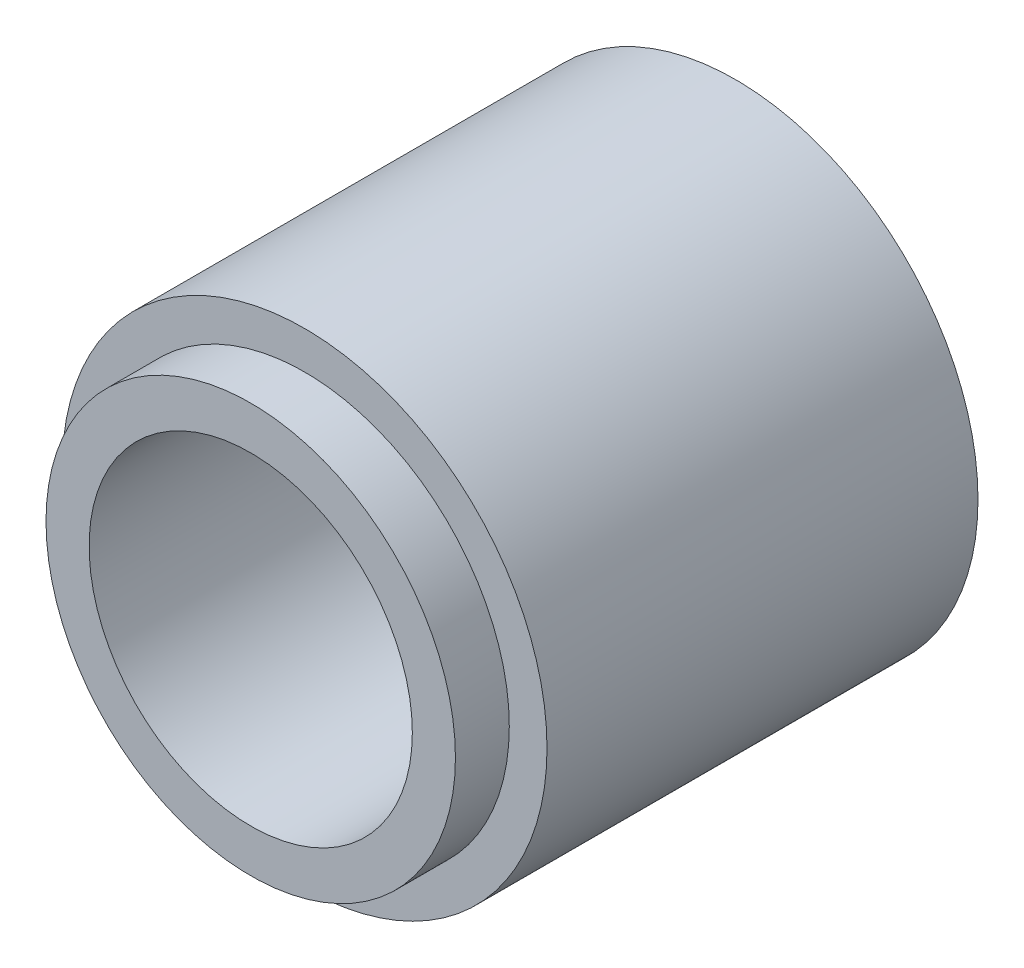
ISO-10303-21;
HEADER;
FILE_DESCRIPTION(('STEP AP214'),'2;1');
FILE_NAME('part.step','',(''),(''),'','','');
FILE_SCHEMA(('AUTOMOTIVE_DESIGN { 1 0 10303 214 1 1 1 1 }'));
ENDSEC;
DATA;
#1=APPLICATION_CONTEXT('core data for automotive mechanical design processes');
#2=APPLICATION_PROTOCOL_DEFINITION('international standard','automotive_design',2000,#1);
#3=PRODUCT_CONTEXT('',#1,'mechanical');
#4=PRODUCT('Part','Part','',(#3));
#5=PRODUCT_RELATED_PRODUCT_CATEGORY('part','',(#4));
#6=PRODUCT_DEFINITION_FORMATION('','',#4);
#7=PRODUCT_DEFINITION_CONTEXT('part definition',#1,'design');
#8=PRODUCT_DEFINITION('design','',#6,#7);
#9=PRODUCT_DEFINITION_SHAPE('','',#8);
#10=(LENGTH_UNIT() NAMED_UNIT(*) SI_UNIT(.MILLI.,.METRE.));
#11=(NAMED_UNIT(*) PLANE_ANGLE_UNIT() SI_UNIT($,.RADIAN.));
#12=(NAMED_UNIT(*) SI_UNIT($,.STERADIAN.) SOLID_ANGLE_UNIT());
#13=UNCERTAINTY_MEASURE_WITH_UNIT(LENGTH_MEASURE(1.E-05),#10,'distance_accuracy_value','');
#14=(GEOMETRIC_REPRESENTATION_CONTEXT(3) GLOBAL_UNCERTAINTY_ASSIGNED_CONTEXT((#13)) GLOBAL_UNIT_ASSIGNED_CONTEXT((#10,
#11,#12)) REPRESENTATION_CONTEXT('',''));
#15=CARTESIAN_POINT('',(0.,0.,0.));
#16=DIRECTION('',(0.,0.,1.));
#17=DIRECTION('',(1.,0.,0.));
#18=AXIS2_PLACEMENT_3D('',#15,#16,#17);
#19=CARTESIAN_POINT('',(0.,0.,4.5));
#20=DIRECTION('',(0.,0.,1.));
#21=DIRECTION('',(1.,0.,0.));
#22=AXIS2_PLACEMENT_3D('',#19,#20,#21);
#23=PLANE('',#22);
#24=CARTESIAN_POINT('',(0.,0.,4.5));
#25=DIRECTION('',(0.,0.,1.));
#26=DIRECTION('',(1.,0.,0.));
#27=AXIS2_PLACEMENT_3D('',#24,#25,#26);
#28=CIRCLE('',#27,1.5);
#29=CARTESIAN_POINT('',(1.5,0.,4.5));
#30=VERTEX_POINT('',#29);
#31=EDGE_CURVE('E46',#30,#30,#28,.T.);
#32=ORIENTED_EDGE('',*,*,#31,.F.);
#33=EDGE_LOOP('',(#32));
#34=FACE_BOUND('',#33,.T.);
#35=CARTESIAN_POINT('',(0.,0.,4.5));
#36=DIRECTION('',(0.,0.,1.));
#37=DIRECTION('',(1.,0.,0.));
#38=AXIS2_PLACEMENT_3D('',#35,#36,#37);
#39=CIRCLE('',#38,1.9);
#40=CARTESIAN_POINT('',(1.9,0.,4.5));
#41=VERTEX_POINT('',#40);
#42=EDGE_CURVE('E60',#41,#41,#39,.T.);
#43=ORIENTED_EDGE('',*,*,#42,.T.);
#44=EDGE_LOOP('',(#43));
#45=FACE_BOUND('',#44,.T.);
#46=ADVANCED_FACE('F39',(#34,#45),#23,.T.);
#47=CARTESIAN_POINT('',(0.,0.,4.5));
#48=DIRECTION('',(0.,0.,-1.));
#49=DIRECTION('',(-1.,0.,0.));
#50=AXIS2_PLACEMENT_3D('',#47,#48,#49);
#51=CYLINDRICAL_SURFACE('',#50,2.25);
#52=CARTESIAN_POINT('',(0.,0.,0.));
#53=DIRECTION('',(0.,0.,1.));
#54=DIRECTION('',(1.,0.,0.));
#55=AXIS2_PLACEMENT_3D('',#52,#53,#54);
#56=CIRCLE('',#55,2.25);
#57=CARTESIAN_POINT('',(2.25,0.,0.));
#58=VERTEX_POINT('',#57);
#59=EDGE_CURVE('E10',#58,#58,#56,.T.);
#60=ORIENTED_EDGE('',*,*,#59,.T.);
#61=EDGE_LOOP('',(#60));
#62=FACE_BOUND('',#61,.T.);
#63=CARTESIAN_POINT('',(0.,0.,4.));
#64=DIRECTION('',(0.,0.,1.));
#65=DIRECTION('',(1.,0.,0.));
#66=AXIS2_PLACEMENT_3D('',#63,#64,#65);
#67=CIRCLE('',#66,2.25);
#68=CARTESIAN_POINT('',(2.25,0.,4.));
#69=VERTEX_POINT('',#68);
#70=EDGE_CURVE('E55',#69,#69,#67,.T.);
#71=ORIENTED_EDGE('',*,*,#70,.F.);
#72=EDGE_LOOP('',(#71));
#73=FACE_BOUND('',#72,.T.);
#74=ADVANCED_FACE('F41',(#62,#73),#51,.T.);
#75=CARTESIAN_POINT('',(0.,0.,0.));
#76=DIRECTION('',(0.,0.,1.));
#77=DIRECTION('',(1.,0.,0.));
#78=AXIS2_PLACEMENT_3D('',#75,#76,#77);
#79=PLANE('',#78);
#80=ORIENTED_EDGE('',*,*,#59,.F.);
#81=EDGE_LOOP('',(#80));
#82=FACE_BOUND('',#81,.T.);
#83=CARTESIAN_POINT('',(0.,0.,0.));
#84=DIRECTION('',(0.,0.,1.));
#85=DIRECTION('',(1.,0.,0.));
#86=AXIS2_PLACEMENT_3D('',#83,#84,#85);
#87=CIRCLE('',#86,1.5);
#88=CARTESIAN_POINT('',(1.5,0.,0.));
#89=VERTEX_POINT('',#88);
#90=EDGE_CURVE('E50',#89,#89,#87,.T.);
#91=ORIENTED_EDGE('',*,*,#90,.T.);
#92=EDGE_LOOP('',(#91));
#93=FACE_BOUND('',#92,.T.);
#94=ADVANCED_FACE('F77',(#82,#93),#79,.F.);
#95=CARTESIAN_POINT('',(0.,0.,4.5));
#96=DIRECTION('',(0.,0.,-1.));
#97=DIRECTION('',(-1.,0.,0.));
#98=AXIS2_PLACEMENT_3D('',#95,#96,#97);
#99=CYLINDRICAL_SURFACE('',#98,1.5);
#100=ORIENTED_EDGE('',*,*,#31,.T.);
#101=EDGE_LOOP('',(#100));
#102=FACE_BOUND('',#101,.T.);
#103=ORIENTED_EDGE('',*,*,#90,.F.);
#104=EDGE_LOOP('',(#103));
#105=FACE_BOUND('',#104,.T.);
#106=ADVANCED_FACE('F72',(#102,#105),#99,.F.);
#107=CARTESIAN_POINT('',(0.,0.,4.));
#108=DIRECTION('',(0.,0.,1.));
#109=DIRECTION('',(1.,0.,0.));
#110=AXIS2_PLACEMENT_3D('',#107,#108,#109);
#111=PLANE('',#110);
#112=CARTESIAN_POINT('',(0.,0.,4.));
#113=DIRECTION('',(0.,0.,1.));
#114=DIRECTION('',(1.,0.,0.));
#115=AXIS2_PLACEMENT_3D('',#112,#113,#114);
#116=CIRCLE('',#115,1.9);
#117=CARTESIAN_POINT('',(1.9,0.,4.));
#118=VERTEX_POINT('',#117);
#119=EDGE_CURVE('E59',#118,#118,#116,.T.);
#120=ORIENTED_EDGE('',*,*,#119,.F.);
#121=EDGE_LOOP('',(#120));
#122=FACE_BOUND('',#121,.T.);
#123=ORIENTED_EDGE('',*,*,#70,.T.);
#124=EDGE_LOOP('',(#123));
#125=FACE_BOUND('',#124,.T.);
#126=ADVANCED_FACE('F69',(#122,#125),#111,.T.);
#127=CARTESIAN_POINT('',(0.,0.,4.));
#128=DIRECTION('',(0.,0.,1.));
#129=DIRECTION('',(1.,0.,0.));
#130=AXIS2_PLACEMENT_3D('',#127,#128,#129);
#131=CYLINDRICAL_SURFACE('',#130,1.9);
#132=ORIENTED_EDGE('',*,*,#119,.T.);
#133=EDGE_LOOP('',(#132));
#134=FACE_BOUND('',#133,.T.);
#135=ORIENTED_EDGE('',*,*,#42,.F.);
#136=EDGE_LOOP('',(#135));
#137=FACE_BOUND('',#136,.T.);
#138=ADVANCED_FACE('F66',(#134,#137),#131,.T.);
#139=CLOSED_SHELL('',(#46,#74,#94,#106,#126,#138));
#140=MANIFOLD_SOLID_BREP('B2',#139);
#141=ADVANCED_BREP_SHAPE_REPRESENTATION('',(#18,#140),#14);
#142=SHAPE_DEFINITION_REPRESENTATION(#9,#141);
ENDSEC;
END-ISO-10303-21;
